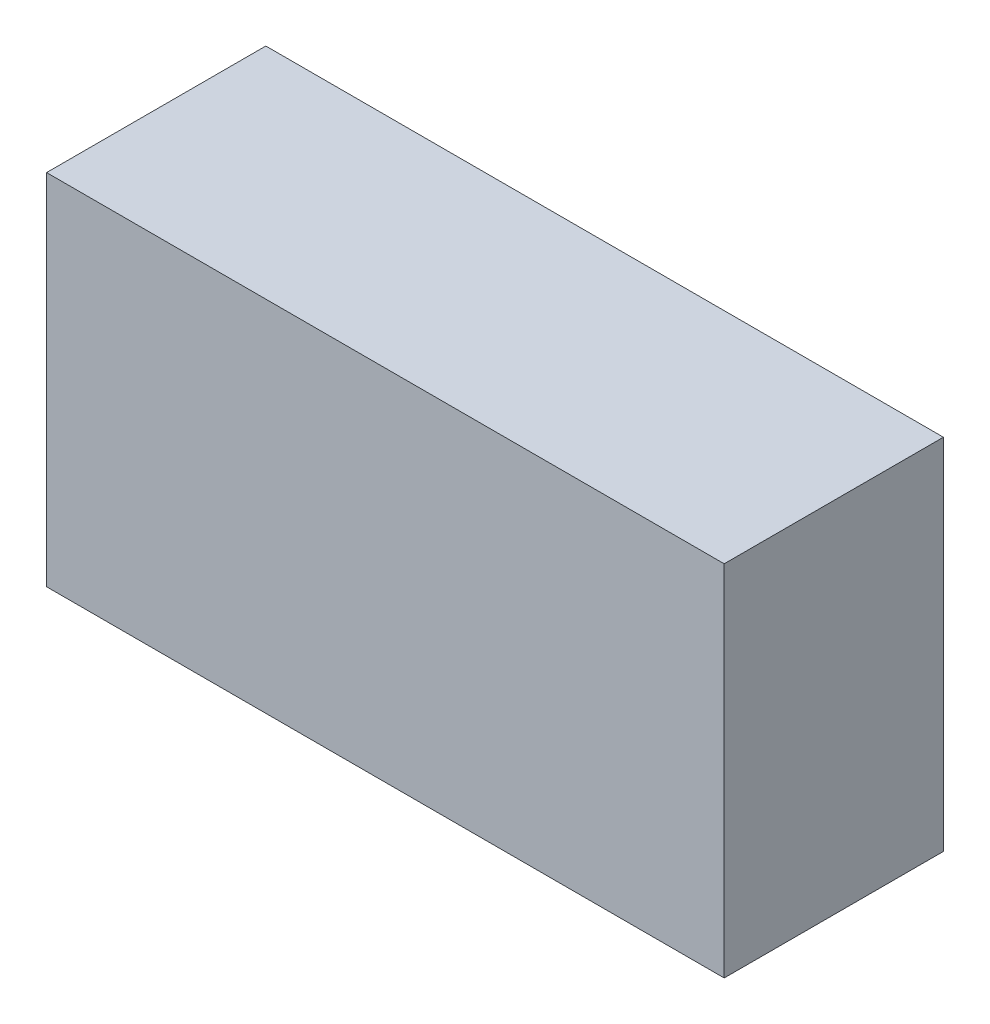
ISO-10303-21;
HEADER;
FILE_DESCRIPTION(('STEP AP214'),'2;1');
FILE_NAME('part.step','',(''),(''),'','','');
FILE_SCHEMA(('AUTOMOTIVE_DESIGN { 1 0 10303 214 1 1 1 1 }'));
ENDSEC;
DATA;
#1=APPLICATION_CONTEXT('core data for automotive mechanical design processes');
#2=APPLICATION_PROTOCOL_DEFINITION('international standard','automotive_design',2000,#1);
#3=PRODUCT_CONTEXT('',#1,'mechanical');
#4=PRODUCT('Part','Part','',(#3));
#5=PRODUCT_RELATED_PRODUCT_CATEGORY('part','',(#4));
#6=PRODUCT_DEFINITION_FORMATION('','',#4);
#7=PRODUCT_DEFINITION_CONTEXT('part definition',#1,'design');
#8=PRODUCT_DEFINITION('design','',#6,#7);
#9=PRODUCT_DEFINITION_SHAPE('','',#8);
#10=(LENGTH_UNIT() NAMED_UNIT(*) SI_UNIT(.MILLI.,.METRE.));
#11=(NAMED_UNIT(*) PLANE_ANGLE_UNIT() SI_UNIT($,.RADIAN.));
#12=(NAMED_UNIT(*) SI_UNIT($,.STERADIAN.) SOLID_ANGLE_UNIT());
#13=UNCERTAINTY_MEASURE_WITH_UNIT(LENGTH_MEASURE(1.E-05),#10,'distance_accuracy_value','');
#14=(GEOMETRIC_REPRESENTATION_CONTEXT(3) GLOBAL_UNCERTAINTY_ASSIGNED_CONTEXT((#13)) GLOBAL_UNIT_ASSIGNED_CONTEXT((#10,
#11,#12)) REPRESENTATION_CONTEXT('',''));
#15=CARTESIAN_POINT('',(0.,0.,0.));
#16=DIRECTION('',(0.,0.,1.));
#17=DIRECTION('',(1.,0.,0.));
#18=AXIS2_PLACEMENT_3D('',#15,#16,#17);
#19=CARTESIAN_POINT('',(3.,23.,11.));
#20=DIRECTION('',(1.,0.,0.));
#21=DIRECTION('',(0.,0.,-1.));
#22=AXIS2_PLACEMENT_3D('',#19,#20,#21);
#23=PLANE('',#22);
#24=DIRECTION('',(0.,-1.,0.));
#25=VECTOR('',#24,1.);
#26=CARTESIAN_POINT('',(3.,23.,0.));
#27=LINE('',#26,#25);
#28=CARTESIAN_POINT('',(3.,23.,0.));
#29=VERTEX_POINT('',#28);
#30=CARTESIAN_POINT('',(3.,5.,0.));
#31=VERTEX_POINT('',#30);
#32=EDGE_CURVE('E104',#29,#31,#27,.T.);
#33=ORIENTED_EDGE('',*,*,#32,.T.);
#34=DIRECTION('',(0.,0.,-1.));
#35=VECTOR('',#34,1.);
#36=CARTESIAN_POINT('',(3.,5.,11.));
#37=LINE('',#36,#35);
#38=CARTESIAN_POINT('',(3.,5.,11.));
#39=VERTEX_POINT('',#38);
#40=EDGE_CURVE('E11',#39,#31,#37,.T.);
#41=ORIENTED_EDGE('',*,*,#40,.F.);
#42=DIRECTION('',(0.,-1.,0.));
#43=VECTOR('',#42,1.);
#44=CARTESIAN_POINT('',(3.,23.,11.));
#45=LINE('',#44,#43);
#46=CARTESIAN_POINT('',(3.,23.,11.));
#47=VERTEX_POINT('',#46);
#48=EDGE_CURVE('E92',#47,#39,#45,.T.);
#49=ORIENTED_EDGE('',*,*,#48,.F.);
#50=DIRECTION('',(0.,0.,-1.));
#51=VECTOR('',#50,1.);
#52=CARTESIAN_POINT('',(3.,23.,11.));
#53=LINE('',#52,#51);
#54=EDGE_CURVE('E100',#47,#29,#53,.T.);
#55=ORIENTED_EDGE('',*,*,#54,.T.);
#56=EDGE_LOOP('',(#33,#41,#49,#55));
#57=FACE_BOUND('',#56,.T.);
#58=ADVANCED_FACE('F41',(#57),#23,.F.);
#59=CARTESIAN_POINT('',(3.,5.,11.));
#60=DIRECTION('',(0.,1.,0.));
#61=DIRECTION('',(0.,0.,1.));
#62=AXIS2_PLACEMENT_3D('',#59,#60,#61);
#63=PLANE('',#62);
#64=DIRECTION('',(1.,0.,0.));
#65=VECTOR('',#64,1.);
#66=CARTESIAN_POINT('',(3.,5.,0.));
#67=LINE('',#66,#65);
#68=CARTESIAN_POINT('',(37.,5.,0.));
#69=VERTEX_POINT('',#68);
#70=EDGE_CURVE('E96',#31,#69,#67,.T.);
#71=ORIENTED_EDGE('',*,*,#70,.T.);
#72=DIRECTION('',(0.,0.,-1.));
#73=VECTOR('',#72,1.);
#74=CARTESIAN_POINT('',(37.,5.,11.));
#75=LINE('',#74,#73);
#76=CARTESIAN_POINT('',(37.,5.,11.));
#77=VERTEX_POINT('',#76);
#78=EDGE_CURVE('E49',#77,#69,#75,.T.);
#79=ORIENTED_EDGE('',*,*,#78,.F.);
#80=DIRECTION('',(1.,0.,0.));
#81=VECTOR('',#80,1.);
#82=CARTESIAN_POINT('',(3.,5.,11.));
#83=LINE('',#82,#81);
#84=EDGE_CURVE('E87',#39,#77,#83,.T.);
#85=ORIENTED_EDGE('',*,*,#84,.F.);
#86=ORIENTED_EDGE('',*,*,#40,.T.);
#87=EDGE_LOOP('',(#71,#79,#85,#86));
#88=FACE_BOUND('',#87,.T.);
#89=ADVANCED_FACE('F95',(#88),#63,.F.);
#90=CARTESIAN_POINT('',(37.,5.,11.));
#91=DIRECTION('',(-1.,0.,0.));
#92=DIRECTION('',(0.,0.,1.));
#93=AXIS2_PLACEMENT_3D('',#90,#91,#92);
#94=PLANE('',#93);
#95=DIRECTION('',(0.,1.,0.));
#96=VECTOR('',#95,1.);
#97=CARTESIAN_POINT('',(37.,5.,0.));
#98=LINE('',#97,#96);
#99=CARTESIAN_POINT('',(37.,23.,0.));
#100=VERTEX_POINT('',#99);
#101=EDGE_CURVE('E74',#69,#100,#98,.T.);
#102=ORIENTED_EDGE('',*,*,#101,.T.);
#103=DIRECTION('',(0.,0.,-1.));
#104=VECTOR('',#103,1.);
#105=CARTESIAN_POINT('',(37.,23.,11.));
#106=LINE('',#105,#104);
#107=CARTESIAN_POINT('',(37.,23.,11.));
#108=VERTEX_POINT('',#107);
#109=EDGE_CURVE('E97',#108,#100,#106,.T.);
#110=ORIENTED_EDGE('',*,*,#109,.F.);
#111=DIRECTION('',(0.,1.,0.));
#112=VECTOR('',#111,1.);
#113=CARTESIAN_POINT('',(37.,5.,11.));
#114=LINE('',#113,#112);
#115=EDGE_CURVE('E90',#77,#108,#114,.T.);
#116=ORIENTED_EDGE('',*,*,#115,.F.);
#117=ORIENTED_EDGE('',*,*,#78,.T.);
#118=EDGE_LOOP('',(#102,#110,#116,#117));
#119=FACE_BOUND('',#118,.T.);
#120=ADVANCED_FACE('F98',(#119),#94,.F.);
#121=CARTESIAN_POINT('',(37.,23.,11.));
#122=DIRECTION('',(0.,-1.,0.));
#123=DIRECTION('',(0.,0.,-1.));
#124=AXIS2_PLACEMENT_3D('',#121,#122,#123);
#125=PLANE('',#124);
#126=DIRECTION('',(-1.,0.,0.));
#127=VECTOR('',#126,1.);
#128=CARTESIAN_POINT('',(37.,23.,0.));
#129=LINE('',#128,#127);
#130=EDGE_CURVE('E80',#100,#29,#129,.T.);
#131=ORIENTED_EDGE('',*,*,#130,.T.);
#132=ORIENTED_EDGE('',*,*,#54,.F.);
#133=DIRECTION('',(-1.,0.,0.));
#134=VECTOR('',#133,1.);
#135=CARTESIAN_POINT('',(37.,23.,11.));
#136=LINE('',#135,#134);
#137=EDGE_CURVE('E57',#108,#47,#136,.T.);
#138=ORIENTED_EDGE('',*,*,#137,.F.);
#139=ORIENTED_EDGE('',*,*,#109,.T.);
#140=EDGE_LOOP('',(#131,#132,#138,#139));
#141=FACE_BOUND('',#140,.T.);
#142=ADVANCED_FACE('F111',(#141),#125,.F.);
#143=CARTESIAN_POINT('',(0.,0.,11.));
#144=DIRECTION('',(0.,0.,1.));
#145=DIRECTION('',(1.,0.,0.));
#146=AXIS2_PLACEMENT_3D('',#143,#144,#145);
#147=PLANE('',#146);
#148=ORIENTED_EDGE('',*,*,#48,.T.);
#149=ORIENTED_EDGE('',*,*,#84,.T.);
#150=ORIENTED_EDGE('',*,*,#115,.T.);
#151=ORIENTED_EDGE('',*,*,#137,.T.);
#152=EDGE_LOOP('',(#148,#149,#150,#151));
#153=FACE_BOUND('',#152,.T.);
#154=ADVANCED_FACE('F88',(#153),#147,.T.);
#155=CARTESIAN_POINT('',(0.,0.,0.));
#156=DIRECTION('',(0.,0.,1.));
#157=DIRECTION('',(1.,0.,0.));
#158=AXIS2_PLACEMENT_3D('',#155,#156,#157);
#159=PLANE('',#158);
#160=ORIENTED_EDGE('',*,*,#32,.F.);
#161=ORIENTED_EDGE('',*,*,#130,.F.);
#162=ORIENTED_EDGE('',*,*,#101,.F.);
#163=ORIENTED_EDGE('',*,*,#70,.F.);
#164=EDGE_LOOP('',(#160,#161,#162,#163));
#165=FACE_BOUND('',#164,.T.);
#166=ADVANCED_FACE('F114',(#165),#159,.F.);
#167=CLOSED_SHELL('',(#58,#89,#120,#142,#154,#166));
#168=MANIFOLD_SOLID_BREP('B2',#167);
#169=ADVANCED_BREP_SHAPE_REPRESENTATION('',(#18,#168),#14);
#170=SHAPE_DEFINITION_REPRESENTATION(#9,#169);
ENDSEC;
END-ISO-10303-21;
